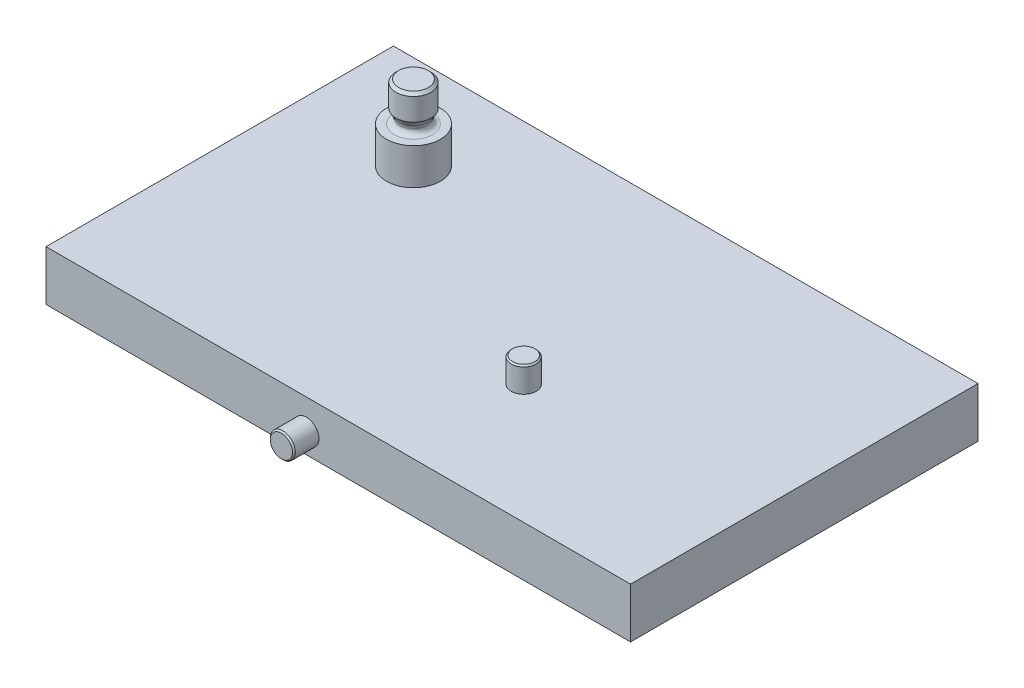
ISO-10303-21;
HEADER;
FILE_DESCRIPTION(('STEP AP214'),'2;1');
FILE_NAME('part.step','',(''),(''),'','','');
FILE_SCHEMA(('AUTOMOTIVE_DESIGN { 1 0 10303 214 1 1 1 1 }'));
ENDSEC;
DATA;
#1=APPLICATION_CONTEXT('core data for automotive mechanical design processes');
#2=APPLICATION_PROTOCOL_DEFINITION('international standard','automotive_design',2000,#1);
#3=PRODUCT_CONTEXT('',#1,'mechanical');
#4=PRODUCT('Part','Part','',(#3));
#5=PRODUCT_RELATED_PRODUCT_CATEGORY('part','',(#4));
#6=PRODUCT_DEFINITION_FORMATION('','',#4);
#7=PRODUCT_DEFINITION_CONTEXT('part definition',#1,'design');
#8=PRODUCT_DEFINITION('design','',#6,#7);
#9=PRODUCT_DEFINITION_SHAPE('','',#8);
#10=(LENGTH_UNIT() NAMED_UNIT(*) SI_UNIT(.MILLI.,.METRE.));
#11=(NAMED_UNIT(*) PLANE_ANGLE_UNIT() SI_UNIT($,.RADIAN.));
#12=(NAMED_UNIT(*) SI_UNIT($,.STERADIAN.) SOLID_ANGLE_UNIT());
#13=UNCERTAINTY_MEASURE_WITH_UNIT(LENGTH_MEASURE(1.E-05),#10,'distance_accuracy_value','');
#14=(GEOMETRIC_REPRESENTATION_CONTEXT(3) GLOBAL_UNCERTAINTY_ASSIGNED_CONTEXT((#13)) GLOBAL_UNIT_ASSIGNED_CONTEXT((#10,
#11,#12)) REPRESENTATION_CONTEXT('',''));
#15=CARTESIAN_POINT('',(0.,0.,0.));
#16=DIRECTION('',(0.,0.,1.));
#17=DIRECTION('',(1.,0.,0.));
#18=AXIS2_PLACEMENT_3D('',#15,#16,#17);
#19=CARTESIAN_POINT('',(-116.712678147737,20.,69.3755807537383));
#20=DIRECTION('',(1.,0.,0.));
#21=DIRECTION('',(0.,0.,-1.));
#22=AXIS2_PLACEMENT_3D('',#19,#20,#21);
#23=PLANE('',#22);
#24=DIRECTION('',(0.,0.,1.));
#25=VECTOR('',#24,1.);
#26=CARTESIAN_POINT('',(-116.712678147737,0.,69.3755807537383));
#27=LINE('',#26,#25);
#28=CARTESIAN_POINT('',(-116.712678147737,0.,-69.3755807537383));
#29=VERTEX_POINT('',#28);
#30=CARTESIAN_POINT('',(-116.712678147737,0.,69.3755807537383));
#31=VERTEX_POINT('',#30);
#32=EDGE_CURVE('E105',#29,#31,#27,.T.);
#33=ORIENTED_EDGE('',*,*,#32,.T.);
#34=DIRECTION('',(0.,-1.,0.));
#35=VECTOR('',#34,1.);
#36=CARTESIAN_POINT('',(-116.712678147737,20.,69.3755807537383));
#37=LINE('',#36,#35);
#38=CARTESIAN_POINT('',(-116.712678147737,20.,69.3755807537383));
#39=VERTEX_POINT('',#38);
#40=EDGE_CURVE('E47',#39,#31,#37,.T.);
#41=ORIENTED_EDGE('',*,*,#40,.F.);
#42=DIRECTION('',(0.,0.,1.));
#43=VECTOR('',#42,1.);
#44=CARTESIAN_POINT('',(-116.712678147737,20.,69.3755807537383));
#45=LINE('',#44,#43);
#46=CARTESIAN_POINT('',(-116.712678147737,20.,-69.3755807537383));
#47=VERTEX_POINT('',#46);
#48=EDGE_CURVE('E91',#47,#39,#45,.T.);
#49=ORIENTED_EDGE('',*,*,#48,.F.);
#50=DIRECTION('',(0.,-1.,0.));
#51=VECTOR('',#50,1.);
#52=CARTESIAN_POINT('',(-116.712678147737,20.,-69.3755807537383));
#53=LINE('',#52,#51);
#54=EDGE_CURVE('E101',#47,#29,#53,.T.);
#55=ORIENTED_EDGE('',*,*,#54,.T.);
#56=EDGE_LOOP('',(#33,#41,#49,#55));
#57=FACE_BOUND('',#56,.T.);
#58=ADVANCED_FACE('F39',(#57),#23,.F.);
#59=CARTESIAN_POINT('',(116.712678147737,20.,69.3755807537383));
#60=DIRECTION('',(0.,0.,-1.));
#61=DIRECTION('',(-1.,0.,0.));
#62=AXIS2_PLACEMENT_3D('',#59,#60,#61);
#63=PLANE('',#62);
#64=CARTESIAN_POINT('',(-12.7105229059504,8.05263612540001,69.3755807537383));
#65=DIRECTION('',(0.,0.,-1.));
#66=DIRECTION('',(-1.,0.,0.));
#67=AXIS2_PLACEMENT_3D('',#64,#65,#66);
#68=CIRCLE('',#67,5.);
#69=CARTESIAN_POINT('',(-17.7105229059504,8.05263612540001,69.3755807537383));
#70=VERTEX_POINT('',#69);
#71=EDGE_CURVE('E390',#70,#70,#68,.T.);
#72=ORIENTED_EDGE('',*,*,#71,.T.);
#73=EDGE_LOOP('',(#72));
#74=FACE_BOUND('',#73,.T.);
#75=DIRECTION('',(1.,0.,0.));
#76=VECTOR('',#75,1.);
#77=CARTESIAN_POINT('',(116.712678147737,0.,69.3755807537383));
#78=LINE('',#77,#76);
#79=CARTESIAN_POINT('',(116.712678147737,0.,69.3755807537383));
#80=VERTEX_POINT('',#79);
#81=EDGE_CURVE('E96',#31,#80,#78,.T.);
#82=ORIENTED_EDGE('',*,*,#81,.T.);
#83=DIRECTION('',(0.,-1.,0.));
#84=VECTOR('',#83,1.);
#85=CARTESIAN_POINT('',(116.712678147737,20.,69.3755807537383));
#86=LINE('',#85,#84);
#87=CARTESIAN_POINT('',(116.712678147737,20.,69.3755807537383));
#88=VERTEX_POINT('',#87);
#89=EDGE_CURVE('E94',#88,#80,#86,.T.);
#90=ORIENTED_EDGE('',*,*,#89,.F.);
#91=DIRECTION('',(1.,0.,0.));
#92=VECTOR('',#91,1.);
#93=CARTESIAN_POINT('',(116.712678147737,20.,69.3755807537383));
#94=LINE('',#93,#92);
#95=EDGE_CURVE('E86',#39,#88,#94,.T.);
#96=ORIENTED_EDGE('',*,*,#95,.F.);
#97=ORIENTED_EDGE('',*,*,#40,.T.);
#98=EDGE_LOOP('',(#82,#90,#96,#97));
#99=FACE_BOUND('',#98,.T.);
#100=ADVANCED_FACE('F95',(#74,#99),#63,.F.);
#101=CARTESIAN_POINT('',(116.712678147737,20.,69.3755807537383));
#102=DIRECTION('',(-1.,0.,0.));
#103=DIRECTION('',(0.,0.,1.));
#104=AXIS2_PLACEMENT_3D('',#101,#102,#103);
#105=PLANE('',#104);
#106=DIRECTION('',(0.,0.,-1.));
#107=VECTOR('',#106,1.);
#108=CARTESIAN_POINT('',(116.712678147737,0.,69.3755807537383));
#109=LINE('',#108,#107);
#110=CARTESIAN_POINT('',(116.712678147737,0.,-69.3755807537383));
#111=VERTEX_POINT('',#110);
#112=EDGE_CURVE('E72',#80,#111,#109,.T.);
#113=ORIENTED_EDGE('',*,*,#112,.T.);
#114=DIRECTION('',(0.,-1.,0.));
#115=VECTOR('',#114,1.);
#116=CARTESIAN_POINT('',(116.712678147737,20.,-69.3755807537383));
#117=LINE('',#116,#115);
#118=CARTESIAN_POINT('',(116.712678147737,20.,-69.3755807537383));
#119=VERTEX_POINT('',#118);
#120=EDGE_CURVE('E97',#119,#111,#117,.T.);
#121=ORIENTED_EDGE('',*,*,#120,.F.);
#122=DIRECTION('',(0.,0.,-1.));
#123=VECTOR('',#122,1.);
#124=CARTESIAN_POINT('',(116.712678147737,20.,69.3755807537383));
#125=LINE('',#124,#123);
#126=EDGE_CURVE('E89',#88,#119,#125,.T.);
#127=ORIENTED_EDGE('',*,*,#126,.F.);
#128=ORIENTED_EDGE('',*,*,#89,.T.);
#129=EDGE_LOOP('',(#113,#121,#127,#128));
#130=FACE_BOUND('',#129,.T.);
#131=ADVANCED_FACE('F99',(#130),#105,.F.);
#132=CARTESIAN_POINT('',(116.712678147737,20.,-69.3755807537383));
#133=DIRECTION('',(0.,0.,1.));
#134=DIRECTION('',(1.,0.,0.));
#135=AXIS2_PLACEMENT_3D('',#132,#133,#134);
#136=PLANE('',#135);
#137=DIRECTION('',(-1.,0.,0.));
#138=VECTOR('',#137,1.);
#139=CARTESIAN_POINT('',(116.712678147737,0.,-69.3755807537383));
#140=LINE('',#139,#138);
#141=EDGE_CURVE('E78',#111,#29,#140,.T.);
#142=ORIENTED_EDGE('',*,*,#141,.T.);
#143=ORIENTED_EDGE('',*,*,#54,.F.);
#144=DIRECTION('',(-1.,0.,0.));
#145=VECTOR('',#144,1.);
#146=CARTESIAN_POINT('',(116.712678147737,20.,-69.3755807537383));
#147=LINE('',#146,#145);
#148=EDGE_CURVE('E55',#119,#47,#147,.T.);
#149=ORIENTED_EDGE('',*,*,#148,.F.);
#150=ORIENTED_EDGE('',*,*,#120,.T.);
#151=EDGE_LOOP('',(#142,#143,#149,#150));
#152=FACE_BOUND('',#151,.T.);
#153=ADVANCED_FACE('F127',(#152),#136,.F.);
#154=CARTESIAN_POINT('',(0.,20.,0.));
#155=DIRECTION('',(0.,1.,0.));
#156=DIRECTION('',(0.,0.,1.));
#157=AXIS2_PLACEMENT_3D('',#154,#155,#156);
#158=PLANE('',#157);
#159=CARTESIAN_POINT('',(26.2043197167827,20.,21.5239044327973));
#160=DIRECTION('',(0.,1.,0.));
#161=DIRECTION('',(0.,0.,1.));
#162=AXIS2_PLACEMENT_3D('',#159,#160,#161);
#163=CIRCLE('',#162,5.);
#164=CARTESIAN_POINT('',(26.2043197167827,20.,26.5239044327973));
#165=VERTEX_POINT('',#164);
#166=EDGE_CURVE('E11',#165,#165,#163,.T.);
#167=ORIENTED_EDGE('',*,*,#166,.F.);
#168=EDGE_LOOP('',(#167));
#169=FACE_BOUND('',#168,.T.);
#170=CARTESIAN_POINT('',(-71.2999808724263,20.,-31.9578861635324));
#171=DIRECTION('',(0.,1.,0.));
#172=DIRECTION('',(0.,0.,1.));
#173=AXIS2_PLACEMENT_3D('',#170,#171,#172);
#174=CIRCLE('',#173,10.7512155611931);
#175=CARTESIAN_POINT('',(-71.2999808724263,20.,-21.2066706023393));
#176=VERTEX_POINT('',#175);
#177=EDGE_CURVE('E108',#176,#176,#174,.T.);
#178=ORIENTED_EDGE('',*,*,#177,.F.);
#179=EDGE_LOOP('',(#178));
#180=FACE_BOUND('',#179,.T.);
#181=ORIENTED_EDGE('',*,*,#48,.T.);
#182=ORIENTED_EDGE('',*,*,#95,.T.);
#183=ORIENTED_EDGE('',*,*,#126,.T.);
#184=ORIENTED_EDGE('',*,*,#148,.T.);
#185=EDGE_LOOP('',(#181,#182,#183,#184));
#186=FACE_BOUND('',#185,.T.);
#187=ADVANCED_FACE('F87',(#169,#180,#186),#158,.T.);
#188=CARTESIAN_POINT('',(0.,0.,0.));
#189=DIRECTION('',(0.,1.,0.));
#190=DIRECTION('',(0.,0.,1.));
#191=AXIS2_PLACEMENT_3D('',#188,#189,#190);
#192=PLANE('',#191);
#193=ORIENTED_EDGE('',*,*,#32,.F.);
#194=ORIENTED_EDGE('',*,*,#141,.F.);
#195=ORIENTED_EDGE('',*,*,#112,.F.);
#196=ORIENTED_EDGE('',*,*,#81,.F.);
#197=EDGE_LOOP('',(#193,#194,#195,#196));
#198=FACE_BOUND('',#197,.T.);
#199=ADVANCED_FACE('F116',(#198),#192,.F.);
#200=CARTESIAN_POINT('',(-71.2999808724263,50.,-31.9578861635324));
#201=DIRECTION('',(0.,-1.,0.));
#202=DIRECTION('',(0.,0.,-1.));
#203=AXIS2_PLACEMENT_3D('',#200,#201,#202);
#204=CYLINDRICAL_SURFACE('',#203,10.7512155611931);
#205=CARTESIAN_POINT('',(-71.2999808724263,34.5392304845412,-31.9578861635324));
#206=DIRECTION('',(0.,-1.,0.));
#207=DIRECTION('',(0.,0.,-1.));
#208=AXIS2_PLACEMENT_3D('',#205,#206,#207);
#209=CIRCLE('',#208,10.7512155611931);
#210=CARTESIAN_POINT('',(-71.2999808724263,34.5392304845412,-42.7091017247255));
#211=VERTEX_POINT('',#210);
#212=EDGE_CURVE('E346',#211,#211,#209,.T.);
#213=ORIENTED_EDGE('',*,*,#212,.T.);
#214=EDGE_LOOP('',(#213));
#215=FACE_BOUND('',#214,.T.);
#216=ORIENTED_EDGE('',*,*,#177,.T.);
#217=EDGE_LOOP('',(#216));
#218=FACE_BOUND('',#217,.T.);
#219=ADVANCED_FACE('F118',(#215,#218),#204,.T.);
#220=CARTESIAN_POINT('',(-71.2999808724263,50.,-31.9578861635324));
#221=DIRECTION('',(0.,-1.,0.));
#222=DIRECTION('',(0.,0.,-1.));
#223=AXIS2_PLACEMENT_3D('',#220,#221,#222);
#224=CYLINDRICAL_SURFACE('',#223,7.00000000000001);
#225=CARTESIAN_POINT('',(-71.2999808724263,40.,-31.9578861635324));
#226=DIRECTION('',(0.,-1.,0.));
#227=DIRECTION('',(0.,0.,-1.));
#228=AXIS2_PLACEMENT_3D('',#225,#226,#227);
#229=CIRCLE('',#228,7.00000000000001);
#230=CARTESIAN_POINT('',(-71.2999808724263,40.,-38.9578861635324));
#231=VERTEX_POINT('',#230);
#232=EDGE_CURVE('E338',#231,#231,#229,.T.);
#233=ORIENTED_EDGE('',*,*,#232,.F.);
#234=EDGE_LOOP('',(#233));
#235=FACE_BOUND('',#234,.T.);
#236=CARTESIAN_POINT('',(-71.2999808724263,48.8985,-31.9578861635324));
#237=DIRECTION('',(0.,-1.,0.));
#238=DIRECTION('',(0.,0.,-1.));
#239=AXIS2_PLACEMENT_3D('',#236,#237,#238);
#240=CIRCLE('',#239,7.00000000000001);
#241=CARTESIAN_POINT('',(-71.2999808724263,48.8985,-38.9578861635324));
#242=VERTEX_POINT('',#241);
#243=EDGE_CURVE('E341',#242,#242,#240,.T.);
#244=ORIENTED_EDGE('',*,*,#243,.T.);
#245=EDGE_LOOP('',(#244));
#246=FACE_BOUND('',#245,.T.);
#247=ADVANCED_FACE('F124',(#235,#246),#224,.T.);
#248=CARTESIAN_POINT('',(-71.2999808724263,40.,-31.9578861635324));
#249=DIRECTION('',(0.,1.,0.));
#250=DIRECTION('',(0.,0.,1.));
#251=AXIS2_PLACEMENT_3D('',#248,#249,#250);
#252=CONICAL_SURFACE('',#251,7.00000000000001,0.523598775598275);
#253=CARTESIAN_POINT('',(-71.2999808724263,37.8892304845412,-31.9578861635324));
#254=DIRECTION('',(0.,-1.,0.));
#255=DIRECTION('',(0.,0.,-1.));
#256=AXIS2_PLACEMENT_3D('',#253,#254,#255);
#257=CIRCLE('',#256,5.78134665205265);
#258=CARTESIAN_POINT('',(-71.2999808724263,37.8892304845412,-37.7392328155851));
#259=VERTEX_POINT('',#258);
#260=EDGE_CURVE('E364',#259,#259,#257,.T.);
#261=ORIENTED_EDGE('',*,*,#260,.F.);
#262=EDGE_LOOP('',(#261));
#263=FACE_BOUND('',#262,.T.);
#264=ORIENTED_EDGE('',*,*,#232,.T.);
#265=EDGE_LOOP('',(#264));
#266=FACE_BOUND('',#265,.T.);
#267=ADVANCED_FACE('F288',(#263,#266),#252,.T.);
#268=CARTESIAN_POINT('',(-71.2999808724263,36.8392304845412,-31.9578861635324));
#269=DIRECTION('',(0.,-1.,0.));
#270=DIRECTION('',(0.,0.,-1.));
#271=AXIS2_PLACEMENT_3D('',#268,#269,#270);
#272=TOROIDAL_SURFACE('',#271,7.6,2.1);
#273=CARTESIAN_POINT('',(-71.2999808724263,36.8392304845412,-31.9578861635324));
#274=DIRECTION('',(0.,-1.,0.));
#275=DIRECTION('',(0.,0.,-1.));
#276=AXIS2_PLACEMENT_3D('',#273,#274,#275);
#277=CIRCLE('',#276,5.50000000000001);
#278=CARTESIAN_POINT('',(-71.2999808724263,36.8392304845412,-37.4578861635324));
#279=VERTEX_POINT('',#278);
#280=EDGE_CURVE('E361',#279,#279,#277,.T.);
#281=ORIENTED_EDGE('',*,*,#280,.F.);
#282=EDGE_LOOP('',(#281));
#283=FACE_BOUND('',#282,.T.);
#284=ORIENTED_EDGE('',*,*,#260,.T.);
#285=EDGE_LOOP('',(#284));
#286=FACE_BOUND('',#285,.T.);
#287=ADVANCED_FACE('F280',(#283,#286),#272,.F.);
#288=CARTESIAN_POINT('',(-71.2999808724263,50.,-31.9578861635324));
#289=DIRECTION('',(0.,-1.,0.));
#290=DIRECTION('',(0.,0.,-1.));
#291=AXIS2_PLACEMENT_3D('',#288,#289,#290);
#292=CYLINDRICAL_SURFACE('',#291,5.50000000000001);
#293=CARTESIAN_POINT('',(-71.2999808724263,36.6392304845412,-31.9578861635324));
#294=DIRECTION('',(0.,-1.,0.));
#295=DIRECTION('',(0.,0.,-1.));
#296=AXIS2_PLACEMENT_3D('',#293,#294,#295);
#297=CIRCLE('',#296,5.50000000000001);
#298=CARTESIAN_POINT('',(-71.2999808724263,36.6392304845412,-37.4578861635324));
#299=VERTEX_POINT('',#298);
#300=EDGE_CURVE('E358',#299,#299,#297,.T.);
#301=ORIENTED_EDGE('',*,*,#300,.F.);
#302=EDGE_LOOP('',(#301));
#303=FACE_BOUND('',#302,.T.);
#304=ORIENTED_EDGE('',*,*,#280,.T.);
#305=EDGE_LOOP('',(#304));
#306=FACE_BOUND('',#305,.T.);
#307=ADVANCED_FACE('F272',(#303,#306),#292,.T.);
#308=CARTESIAN_POINT('',(-71.2999808724263,36.6392304845412,-31.9578861635324));
#309=DIRECTION('',(0.,-1.,0.));
#310=DIRECTION('',(0.,0.,-1.));
#311=AXIS2_PLACEMENT_3D('',#308,#309,#310);
#312=TOROIDAL_SURFACE('',#311,7.6,2.1);
#313=CARTESIAN_POINT('',(-71.2999808724263,34.5392304845412,-31.9578861635324));
#314=DIRECTION('',(0.,-1.,0.));
#315=DIRECTION('',(0.,0.,-1.));
#316=AXIS2_PLACEMENT_3D('',#313,#314,#315);
#317=CIRCLE('',#316,7.6);
#318=CARTESIAN_POINT('',(-71.2999808724263,34.5392304845412,-39.5578861635324));
#319=VERTEX_POINT('',#318);
#320=EDGE_CURVE('E355',#319,#319,#317,.T.);
#321=ORIENTED_EDGE('',*,*,#320,.F.);
#322=EDGE_LOOP('',(#321));
#323=FACE_BOUND('',#322,.T.);
#324=ORIENTED_EDGE('',*,*,#300,.T.);
#325=EDGE_LOOP('',(#324));
#326=FACE_BOUND('',#325,.T.);
#327=ADVANCED_FACE('F264',(#323,#326),#312,.F.);
#328=CARTESIAN_POINT('',(-63.6999808724263,34.5392304845412,-31.9578861635324));
#329=DIRECTION('',(0.,-1.,0.));
#330=DIRECTION('',(0.,0.,-1.));
#331=AXIS2_PLACEMENT_3D('',#328,#329,#330);
#332=PLANE('',#331);
#333=ORIENTED_EDGE('',*,*,#212,.F.);
#334=EDGE_LOOP('',(#333));
#335=FACE_BOUND('',#334,.T.);
#336=ORIENTED_EDGE('',*,*,#320,.T.);
#337=EDGE_LOOP('',(#336));
#338=FACE_BOUND('',#337,.T.);
#339=ADVANCED_FACE('F256',(#335,#338),#332,.F.);
#340=CARTESIAN_POINT('',(-71.2999808724263,50.,-31.9578861635324));
#341=DIRECTION('',(0.,-1.,0.));
#342=DIRECTION('',(0.,0.,-1.));
#343=AXIS2_PLACEMENT_3D('',#340,#341,#342);
#344=CONICAL_SURFACE('',#343,5.8985,0.785398163397458);
#345=ORIENTED_EDGE('',*,*,#243,.F.);
#346=EDGE_LOOP('',(#345));
#347=FACE_BOUND('',#346,.T.);
#348=CARTESIAN_POINT('',(-71.2999808724263,50.,-31.9578861635324));
#349=DIRECTION('',(0.,-1.,0.));
#350=DIRECTION('',(0.,0.,-1.));
#351=AXIS2_PLACEMENT_3D('',#348,#349,#350);
#352=CIRCLE('',#351,5.8985);
#353=CARTESIAN_POINT('',(-71.2999808724263,50.,-37.8563861635324));
#354=VERTEX_POINT('',#353);
#355=EDGE_CURVE('E342',#354,#354,#352,.T.);
#356=ORIENTED_EDGE('',*,*,#355,.T.);
#357=EDGE_LOOP('',(#356));
#358=FACE_BOUND('',#357,.T.);
#359=ADVANCED_FACE('F250',(#347,#358),#344,.T.);
#360=CARTESIAN_POINT('',(-71.2999808724263,50.,-31.9578861635324));
#361=DIRECTION('',(0.,1.,0.));
#362=DIRECTION('',(0.,0.,1.));
#363=AXIS2_PLACEMENT_3D('',#360,#361,#362);
#364=PLANE('',#363);
#365=ORIENTED_EDGE('',*,*,#355,.F.);
#366=EDGE_LOOP('',(#365));
#367=FACE_BOUND('',#366,.T.);
#368=ADVANCED_FACE('F157',(#367),#364,.T.);
#369=CARTESIAN_POINT('',(30.6498197167827,30.,21.5239044327973));
#370=DIRECTION('',(0.,1.,0.));
#371=DIRECTION('',(0.,0.,1.));
#372=AXIS2_PLACEMENT_3D('',#369,#370,#371);
#373=PLANE('',#372);
#374=CARTESIAN_POINT('',(26.2043197167827,30.,21.5239044327973));
#375=DIRECTION('',(0.,-1.,0.));
#376=DIRECTION('',(0.,0.,-1.));
#377=AXIS2_PLACEMENT_3D('',#374,#375,#376);
#378=CIRCLE('',#377,4.4455);
#379=CARTESIAN_POINT('',(26.2043197167827,30.,17.0784044327973));
#380=VERTEX_POINT('',#379);
#381=EDGE_CURVE('E343',#380,#380,#378,.T.);
#382=ORIENTED_EDGE('',*,*,#381,.F.);
#383=EDGE_LOOP('',(#382));
#384=FACE_BOUND('',#383,.T.);
#385=ADVANCED_FACE('F162',(#384),#373,.T.);
#386=CARTESIAN_POINT('',(26.2043197167827,29.4455,21.5239044327973));
#387=DIRECTION('',(0.,-1.,0.));
#388=DIRECTION('',(0.,0.,-1.));
#389=AXIS2_PLACEMENT_3D('',#386,#387,#388);
#390=CONICAL_SURFACE('',#389,5.,0.785398163397451);
#391=ORIENTED_EDGE('',*,*,#381,.T.);
#392=EDGE_LOOP('',(#391));
#393=FACE_BOUND('',#392,.T.);
#394=CARTESIAN_POINT('',(26.2043197167827,29.4455,21.5239044327973));
#395=DIRECTION('',(0.,-1.,0.));
#396=DIRECTION('',(0.,0.,-1.));
#397=AXIS2_PLACEMENT_3D('',#394,#395,#396);
#398=CIRCLE('',#397,5.);
#399=CARTESIAN_POINT('',(26.2043197167827,29.4455,16.5239044327973));
#400=VERTEX_POINT('',#399);
#401=EDGE_CURVE('E349',#400,#400,#398,.T.);
#402=ORIENTED_EDGE('',*,*,#401,.F.);
#403=EDGE_LOOP('',(#402));
#404=FACE_BOUND('',#403,.T.);
#405=ADVANCED_FACE('F168',(#393,#404),#390,.T.);
#406=CARTESIAN_POINT('',(26.2043197167827,20.,21.5239044327973));
#407=DIRECTION('',(0.,-1.,0.));
#408=DIRECTION('',(0.,0.,-1.));
#409=AXIS2_PLACEMENT_3D('',#406,#407,#408);
#410=CYLINDRICAL_SURFACE('',#409,5.);
#411=ORIENTED_EDGE('',*,*,#401,.T.);
#412=EDGE_LOOP('',(#411));
#413=FACE_BOUND('',#412,.T.);
#414=ORIENTED_EDGE('',*,*,#166,.T.);
#415=EDGE_LOOP('',(#414));
#416=FACE_BOUND('',#415,.T.);
#417=ADVANCED_FACE('F181',(#413,#416),#410,.T.);
#418=CARTESIAN_POINT('',(-8.26502290595037,8.05263612540001,79.3755807537383));
#419=DIRECTION('',(0.,0.,1.));
#420=DIRECTION('',(1.,0.,0.));
#421=AXIS2_PLACEMENT_3D('',#418,#419,#420);
#422=PLANE('',#421);
#423=CARTESIAN_POINT('',(-12.7105229059504,8.05263612540001,79.3755807537383));
#424=DIRECTION('',(0.,0.,-1.));
#425=DIRECTION('',(-1.,0.,0.));
#426=AXIS2_PLACEMENT_3D('',#423,#424,#425);
#427=CIRCLE('',#426,4.4455);
#428=CARTESIAN_POINT('',(-17.1560229059504,8.05263612540001,79.3755807537383));
#429=VERTEX_POINT('',#428);
#430=EDGE_CURVE('E384',#429,#429,#427,.T.);
#431=ORIENTED_EDGE('',*,*,#430,.F.);
#432=EDGE_LOOP('',(#431));
#433=FACE_BOUND('',#432,.T.);
#434=ADVANCED_FACE('F192',(#433),#422,.T.);
#435=CARTESIAN_POINT('',(-12.7105229059504,8.05263612540001,78.8210807537383));
#436=DIRECTION('',(0.,0.,-1.));
#437=DIRECTION('',(-1.,0.,0.));
#438=AXIS2_PLACEMENT_3D('',#435,#436,#437);
#439=CONICAL_SURFACE('',#438,5.,0.785398163397436);
#440=ORIENTED_EDGE('',*,*,#430,.T.);
#441=EDGE_LOOP('',(#440));
#442=FACE_BOUND('',#441,.T.);
#443=CARTESIAN_POINT('',(-12.7105229059504,8.05263612540001,78.8210807537383));
#444=DIRECTION('',(0.,0.,-1.));
#445=DIRECTION('',(-1.,0.,0.));
#446=AXIS2_PLACEMENT_3D('',#443,#444,#445);
#447=CIRCLE('',#446,5.);
#448=CARTESIAN_POINT('',(-17.7105229059504,8.05263612540001,78.8210807537383));
#449=VERTEX_POINT('',#448);
#450=EDGE_CURVE('E387',#449,#449,#447,.T.);
#451=ORIENTED_EDGE('',*,*,#450,.F.);
#452=EDGE_LOOP('',(#451));
#453=FACE_BOUND('',#452,.T.);
#454=ADVANCED_FACE('F212',(#442,#453),#439,.T.);
#455=CARTESIAN_POINT('',(-12.7105229059504,8.05263612540001,69.3755807537383));
#456=DIRECTION('',(0.,0.,-1.));
#457=DIRECTION('',(-1.,0.,0.));
#458=AXIS2_PLACEMENT_3D('',#455,#456,#457);
#459=CYLINDRICAL_SURFACE('',#458,5.);
#460=ORIENTED_EDGE('',*,*,#450,.T.);
#461=EDGE_LOOP('',(#460));
#462=FACE_BOUND('',#461,.T.);
#463=ORIENTED_EDGE('',*,*,#71,.F.);
#464=EDGE_LOOP('',(#463));
#465=FACE_BOUND('',#464,.T.);
#466=ADVANCED_FACE('F223',(#462,#465),#459,.T.);
#467=CLOSED_SHELL('',(#58,#100,#131,#153,#187,#199,#219,#247,#267,#287,#307,#327,#339,#359,#368,
#385,#405,#417,#434,#454,#466));
#468=MANIFOLD_SOLID_BREP('B2',#467);
#469=ADVANCED_BREP_SHAPE_REPRESENTATION('',(#18,#468),#14);
#470=SHAPE_DEFINITION_REPRESENTATION(#9,#469);
ENDSEC;
END-ISO-10303-21;
